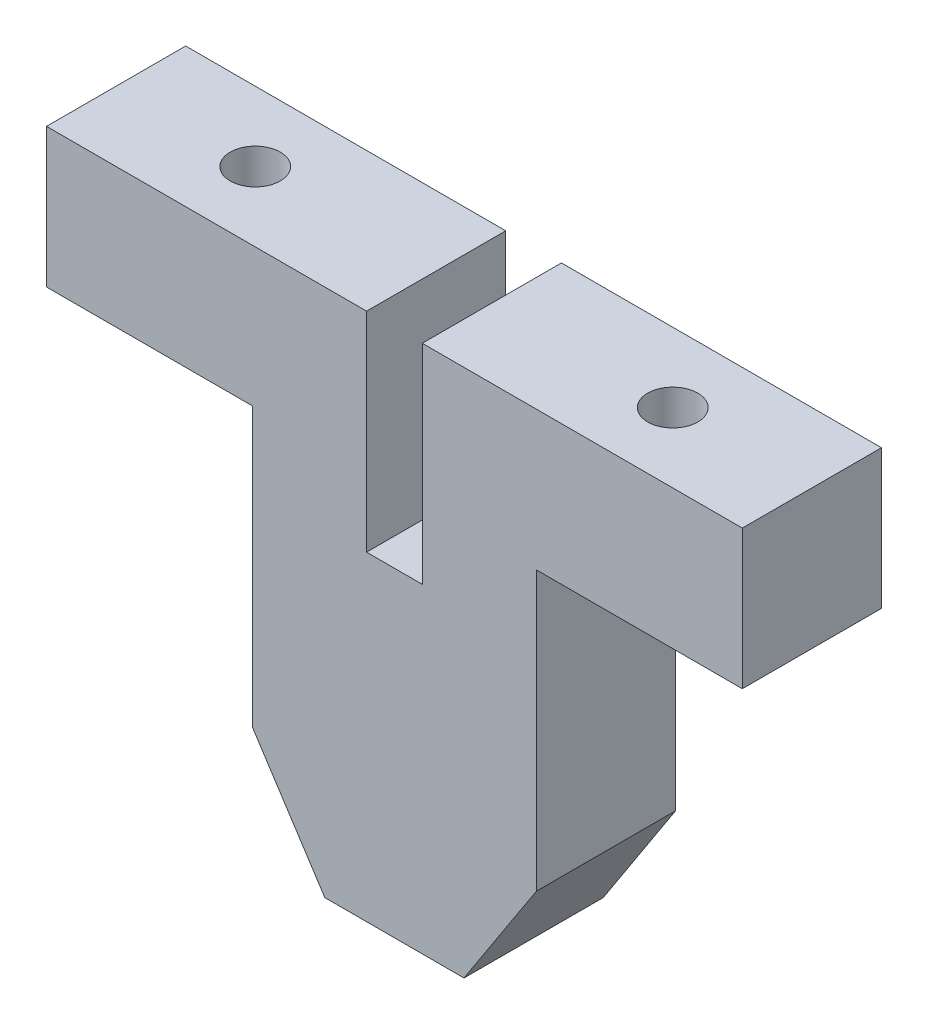
ISO-10303-21;
HEADER;
FILE_DESCRIPTION(('STEP AP214'),'2;1');
FILE_NAME('part.step','',(''),(''),'','','');
FILE_SCHEMA(('AUTOMOTIVE_DESIGN { 1 0 10303 214 1 1 1 1 }'));
ENDSEC;
DATA;
#1=APPLICATION_CONTEXT('core data for automotive mechanical design processes');
#2=APPLICATION_PROTOCOL_DEFINITION('international standard','automotive_design',2000,#1);
#3=PRODUCT_CONTEXT('',#1,'mechanical');
#4=PRODUCT('Part','Part','',(#3));
#5=PRODUCT_RELATED_PRODUCT_CATEGORY('part','',(#4));
#6=PRODUCT_DEFINITION_FORMATION('','',#4);
#7=PRODUCT_DEFINITION_CONTEXT('part definition',#1,'design');
#8=PRODUCT_DEFINITION('design','',#6,#7);
#9=PRODUCT_DEFINITION_SHAPE('','',#8);
#10=(LENGTH_UNIT() NAMED_UNIT(*) SI_UNIT(.MILLI.,.METRE.));
#11=(NAMED_UNIT(*) PLANE_ANGLE_UNIT() SI_UNIT($,.RADIAN.));
#12=(NAMED_UNIT(*) SI_UNIT($,.STERADIAN.) SOLID_ANGLE_UNIT());
#13=UNCERTAINTY_MEASURE_WITH_UNIT(LENGTH_MEASURE(1.E-05),#10,'distance_accuracy_value','');
#14=(GEOMETRIC_REPRESENTATION_CONTEXT(3) GLOBAL_UNCERTAINTY_ASSIGNED_CONTEXT((#13)) GLOBAL_UNIT_ASSIGNED_CONTEXT((#10,
#11,#12)) REPRESENTATION_CONTEXT('',''));
#15=CARTESIAN_POINT('',(0.,0.,0.));
#16=DIRECTION('',(0.,0.,1.));
#17=DIRECTION('',(1.,0.,0.));
#18=AXIS2_PLACEMENT_3D('',#15,#16,#17);
#19=CARTESIAN_POINT('',(0.,38.,10.));
#20=DIRECTION('',(0.,-1.,0.));
#21=DIRECTION('',(1.,0.,0.));
#22=AXIS2_PLACEMENT_3D('',#19,#20,#21);
#23=PLANE('',#22);
#24=CARTESIAN_POINT('',(10.,38.,5.));
#25=DIRECTION('',(0.,1.,0.));
#26=DIRECTION('',(-1.,0.,0.));
#27=AXIS2_PLACEMENT_3D('',#24,#25,#26);
#28=CIRCLE('',#27,1.8);
#29=CARTESIAN_POINT('',(8.2,38.,5.));
#30=VERTEX_POINT('',#29);
#31=EDGE_CURVE('E166',#30,#30,#28,.T.);
#32=ORIENTED_EDGE('',*,*,#31,.F.);
#33=EDGE_LOOP('',(#32));
#34=FACE_BOUND('',#33,.T.);
#35=DIRECTION('',(-1.,0.,0.));
#36=VECTOR('',#35,1.);
#37=CARTESIAN_POINT('',(0.,38.,10.));
#38=LINE('',#37,#36);
#39=CARTESIAN_POINT('',(23.,38.,10.));
#40=VERTEX_POINT('',#39);
#41=CARTESIAN_POINT('',(0.,38.,10.));
#42=VERTEX_POINT('',#41);
#43=EDGE_CURVE('E235',#40,#42,#38,.T.);
#44=ORIENTED_EDGE('',*,*,#43,.F.);
#45=DIRECTION('',(0.,0.,1.));
#46=VECTOR('',#45,1.);
#47=CARTESIAN_POINT('',(23.,38.,0.));
#48=LINE('',#47,#46);
#49=CARTESIAN_POINT('',(23.,38.,0.));
#50=VERTEX_POINT('',#49);
#51=EDGE_CURVE('E219',#50,#40,#48,.T.);
#52=ORIENTED_EDGE('',*,*,#51,.F.);
#53=DIRECTION('',(-1.,0.,0.));
#54=VECTOR('',#53,1.);
#55=CARTESIAN_POINT('',(0.,38.,0.));
#56=LINE('',#55,#54);
#57=CARTESIAN_POINT('',(0.,38.,0.));
#58=VERTEX_POINT('',#57);
#59=EDGE_CURVE('E161',#50,#58,#56,.T.);
#60=ORIENTED_EDGE('',*,*,#59,.T.);
#61=DIRECTION('',(0.,0.,-1.));
#62=VECTOR('',#61,1.);
#63=CARTESIAN_POINT('',(0.,38.,10.));
#64=LINE('',#63,#62);
#65=EDGE_CURVE('E42',#42,#58,#64,.T.);
#66=ORIENTED_EDGE('',*,*,#65,.F.);
#67=EDGE_LOOP('',(#44,#52,#60,#66));
#68=FACE_BOUND('',#67,.T.);
#69=ADVANCED_FACE('F33',(#34,#68),#23,.F.);
#70=CARTESIAN_POINT('',(50.,0.,10.));
#71=DIRECTION('',(0.,1.,0.));
#72=DIRECTION('',(-1.,0.,0.));
#73=AXIS2_PLACEMENT_3D('',#70,#71,#72);
#74=PLANE('',#73);
#75=DIRECTION('',(1.,0.,0.));
#76=VECTOR('',#75,1.);
#77=CARTESIAN_POINT('',(50.,0.,10.));
#78=LINE('',#77,#76);
#79=CARTESIAN_POINT('',(20.,0.,10.));
#80=VERTEX_POINT('',#79);
#81=CARTESIAN_POINT('',(30.,0.,10.));
#82=VERTEX_POINT('',#81);
#83=EDGE_CURVE('E173',#80,#82,#78,.T.);
#84=ORIENTED_EDGE('',*,*,#83,.F.);
#85=DIRECTION('',(0.,0.,1.));
#86=VECTOR('',#85,1.);
#87=CARTESIAN_POINT('',(20.,0.,0.));
#88=LINE('',#87,#86);
#89=CARTESIAN_POINT('',(20.,0.,0.));
#90=VERTEX_POINT('',#89);
#91=EDGE_CURVE('E195',#90,#80,#88,.T.);
#92=ORIENTED_EDGE('',*,*,#91,.F.);
#93=DIRECTION('',(1.,0.,0.));
#94=VECTOR('',#93,1.);
#95=CARTESIAN_POINT('',(50.,0.,0.));
#96=LINE('',#95,#94);
#97=CARTESIAN_POINT('',(30.,0.,0.));
#98=VERTEX_POINT('',#97);
#99=EDGE_CURVE('E162',#90,#98,#96,.T.);
#100=ORIENTED_EDGE('',*,*,#99,.T.);
#101=DIRECTION('',(0.,0.,1.));
#102=VECTOR('',#101,1.);
#103=CARTESIAN_POINT('',(30.,0.,0.));
#104=LINE('',#103,#102);
#105=EDGE_CURVE('E197',#98,#82,#104,.T.);
#106=ORIENTED_EDGE('',*,*,#105,.T.);
#107=EDGE_LOOP('',(#84,#92,#100,#106));
#108=FACE_BOUND('',#107,.T.);
#109=ADVANCED_FACE('F35',(#108),#74,.F.);
#110=CARTESIAN_POINT('',(50.,38.,10.));
#111=DIRECTION('',(-1.,0.,0.));
#112=DIRECTION('',(0.,-1.,0.));
#113=AXIS2_PLACEMENT_3D('',#110,#111,#112);
#114=PLANE('',#113);
#115=DIRECTION('',(0.,1.,0.));
#116=VECTOR('',#115,1.);
#117=CARTESIAN_POINT('',(50.,38.,10.));
#118=LINE('',#117,#116);
#119=CARTESIAN_POINT('',(50.,28.,10.));
#120=VERTEX_POINT('',#119);
#121=CARTESIAN_POINT('',(50.,38.,10.));
#122=VERTEX_POINT('',#121);
#123=EDGE_CURVE('E152',#120,#122,#118,.T.);
#124=ORIENTED_EDGE('',*,*,#123,.F.);
#125=DIRECTION('',(0.,0.,1.));
#126=VECTOR('',#125,1.);
#127=CARTESIAN_POINT('',(50.,28.,0.));
#128=LINE('',#127,#126);
#129=CARTESIAN_POINT('',(50.,28.,0.));
#130=VERTEX_POINT('',#129);
#131=EDGE_CURVE('E140',#130,#120,#128,.T.);
#132=ORIENTED_EDGE('',*,*,#131,.F.);
#133=DIRECTION('',(0.,1.,0.));
#134=VECTOR('',#133,1.);
#135=CARTESIAN_POINT('',(50.,38.,0.));
#136=LINE('',#135,#134);
#137=CARTESIAN_POINT('',(50.,38.,0.));
#138=VERTEX_POINT('',#137);
#139=EDGE_CURVE('E151',#130,#138,#136,.T.);
#140=ORIENTED_EDGE('',*,*,#139,.T.);
#141=DIRECTION('',(0.,0.,-1.));
#142=VECTOR('',#141,1.);
#143=CARTESIAN_POINT('',(50.,38.,10.));
#144=LINE('',#143,#142);
#145=EDGE_CURVE('E11',#122,#138,#144,.T.);
#146=ORIENTED_EDGE('',*,*,#145,.F.);
#147=EDGE_LOOP('',(#124,#132,#140,#146));
#148=FACE_BOUND('',#147,.T.);
#149=ADVANCED_FACE('F149',(#148),#114,.F.);
#150=CARTESIAN_POINT('',(40.,38.,5.));
#151=DIRECTION('',(0.,1.,0.));
#152=DIRECTION('',(-1.,0.,0.));
#153=AXIS2_PLACEMENT_3D('',#150,#151,#152);
#154=CIRCLE('',#153,1.8);
#155=CARTESIAN_POINT('',(38.2,38.,5.));
#156=VERTEX_POINT('',#155);
#157=EDGE_CURVE('E221',#156,#156,#154,.T.);
#158=ORIENTED_EDGE('',*,*,#157,.F.);
#159=EDGE_LOOP('',(#158));
#160=FACE_BOUND('',#159,.T.);
#161=CARTESIAN_POINT('',(27.,38.,0.));
#162=VERTEX_POINT('',#161);
#163=EDGE_CURVE('E160',#138,#162,#56,.T.);
#164=ORIENTED_EDGE('',*,*,#163,.T.);
#165=DIRECTION('',(0.,0.,1.));
#166=VECTOR('',#165,1.);
#167=CARTESIAN_POINT('',(27.,38.,0.));
#168=LINE('',#167,#166);
#169=CARTESIAN_POINT('',(27.,38.,10.));
#170=VERTEX_POINT('',#169);
#171=EDGE_CURVE('E222',#162,#170,#168,.T.);
#172=ORIENTED_EDGE('',*,*,#171,.T.);
#173=EDGE_CURVE('E236',#122,#170,#38,.T.);
#174=ORIENTED_EDGE('',*,*,#173,.F.);
#175=ORIENTED_EDGE('',*,*,#145,.T.);
#176=EDGE_LOOP('',(#164,#172,#174,#175));
#177=FACE_BOUND('',#176,.T.);
#178=ADVANCED_FACE('F285',(#160,#177),#23,.F.);
#179=CARTESIAN_POINT('',(0.,0.,10.));
#180=DIRECTION('',(1.,0.,0.));
#181=DIRECTION('',(0.,1.,0.));
#182=AXIS2_PLACEMENT_3D('',#179,#180,#181);
#183=PLANE('',#182);
#184=DIRECTION('',(0.,-1.,0.));
#185=VECTOR('',#184,1.);
#186=CARTESIAN_POINT('',(0.,0.,0.));
#187=LINE('',#186,#185);
#188=CARTESIAN_POINT('',(0.,28.,0.));
#189=VERTEX_POINT('',#188);
#190=EDGE_CURVE('E170',#58,#189,#187,.T.);
#191=ORIENTED_EDGE('',*,*,#190,.T.);
#192=DIRECTION('',(0.,0.,1.));
#193=VECTOR('',#192,1.);
#194=CARTESIAN_POINT('',(0.,28.,0.));
#195=LINE('',#194,#193);
#196=CARTESIAN_POINT('',(0.,28.,10.));
#197=VERTEX_POINT('',#196);
#198=EDGE_CURVE('E178',#189,#197,#195,.T.);
#199=ORIENTED_EDGE('',*,*,#198,.T.);
#200=DIRECTION('',(0.,-1.,0.));
#201=VECTOR('',#200,1.);
#202=CARTESIAN_POINT('',(0.,0.,10.));
#203=LINE('',#202,#201);
#204=EDGE_CURVE('E175',#42,#197,#203,.T.);
#205=ORIENTED_EDGE('',*,*,#204,.F.);
#206=ORIENTED_EDGE('',*,*,#65,.T.);
#207=EDGE_LOOP('',(#191,#199,#205,#206));
#208=FACE_BOUND('',#207,.T.);
#209=ADVANCED_FACE('F245',(#208),#183,.F.);
#210=CARTESIAN_POINT('',(0.,0.,10.));
#211=DIRECTION('',(0.,0.,-1.));
#212=DIRECTION('',(-1.,0.,0.));
#213=AXIS2_PLACEMENT_3D('',#210,#211,#212);
#214=PLANE('',#213);
#215=ORIENTED_EDGE('',*,*,#204,.T.);
#216=DIRECTION('',(-1.,0.,0.));
#217=VECTOR('',#216,1.);
#218=CARTESIAN_POINT('',(0.,28.,10.));
#219=LINE('',#218,#217);
#220=CARTESIAN_POINT('',(14.8,28.,10.));
#221=VERTEX_POINT('',#220);
#222=EDGE_CURVE('E145',#221,#197,#219,.T.);
#223=ORIENTED_EDGE('',*,*,#222,.F.);
#224=DIRECTION('',(0.,1.,0.));
#225=VECTOR('',#224,1.);
#226=CARTESIAN_POINT('',(14.8,28.,10.));
#227=LINE('',#226,#225);
#228=CARTESIAN_POINT('',(14.8,8.00000000000001,10.));
#229=VERTEX_POINT('',#228);
#230=EDGE_CURVE('E266',#229,#221,#227,.T.);
#231=ORIENTED_EDGE('',*,*,#230,.F.);
#232=DIRECTION('',(-0.544988350595414,0.838443616300637,0.));
#233=VECTOR('',#232,1.);
#234=CARTESIAN_POINT('',(14.8,8.00000000000001,10.));
#235=LINE('',#234,#233);
#236=EDGE_CURVE('E264',#80,#229,#235,.T.);
#237=ORIENTED_EDGE('',*,*,#236,.F.);
#238=ORIENTED_EDGE('',*,*,#83,.T.);
#239=DIRECTION('',(-0.544988350595414,-0.838443616300637,0.));
#240=VECTOR('',#239,1.);
#241=CARTESIAN_POINT('',(30.,0.,10.));
#242=LINE('',#241,#240);
#243=CARTESIAN_POINT('',(35.2,8.00000000000001,10.));
#244=VERTEX_POINT('',#243);
#245=EDGE_CURVE('E262',#244,#82,#242,.T.);
#246=ORIENTED_EDGE('',*,*,#245,.F.);
#247=DIRECTION('',(0.,-1.,0.));
#248=VECTOR('',#247,1.);
#249=CARTESIAN_POINT('',(35.2,8.00000000000001,10.));
#250=LINE('',#249,#248);
#251=CARTESIAN_POINT('',(35.2,28.,10.));
#252=VERTEX_POINT('',#251);
#253=EDGE_CURVE('E259',#252,#244,#250,.T.);
#254=ORIENTED_EDGE('',*,*,#253,.F.);
#255=DIRECTION('',(-1.,0.,0.));
#256=VECTOR('',#255,1.);
#257=CARTESIAN_POINT('',(35.2,28.,10.));
#258=LINE('',#257,#256);
#259=EDGE_CURVE('E257',#120,#252,#258,.T.);
#260=ORIENTED_EDGE('',*,*,#259,.F.);
#261=ORIENTED_EDGE('',*,*,#123,.T.);
#262=ORIENTED_EDGE('',*,*,#173,.T.);
#263=DIRECTION('',(0.,1.,0.));
#264=VECTOR('',#263,1.);
#265=CARTESIAN_POINT('',(27.,38.,10.));
#266=LINE('',#265,#264);
#267=CARTESIAN_POINT('',(27.,23.,10.));
#268=VERTEX_POINT('',#267);
#269=EDGE_CURVE('E207',#268,#170,#266,.T.);
#270=ORIENTED_EDGE('',*,*,#269,.F.);
#271=DIRECTION('',(1.,0.,0.));
#272=VECTOR('',#271,1.);
#273=CARTESIAN_POINT('',(23.,23.,10.));
#274=LINE('',#273,#272);
#275=CARTESIAN_POINT('',(23.,23.,10.));
#276=VERTEX_POINT('',#275);
#277=EDGE_CURVE('E215',#276,#268,#274,.T.);
#278=ORIENTED_EDGE('',*,*,#277,.F.);
#279=DIRECTION('',(0.,-1.,0.));
#280=VECTOR('',#279,1.);
#281=CARTESIAN_POINT('',(23.,38.,10.));
#282=LINE('',#281,#280);
#283=EDGE_CURVE('E182',#40,#276,#282,.T.);
#284=ORIENTED_EDGE('',*,*,#283,.F.);
#285=ORIENTED_EDGE('',*,*,#43,.T.);
#286=EDGE_LOOP('',(#215,#223,#231,#237,#238,#246,#254,#260,#261,#262,#270,#278,#284,#285));
#287=FACE_BOUND('',#286,.T.);
#288=ADVANCED_FACE('F240',(#287),#214,.F.);
#289=CARTESIAN_POINT('',(0.,0.,0.));
#290=DIRECTION('',(0.,0.,-1.));
#291=DIRECTION('',(-1.,0.,0.));
#292=AXIS2_PLACEMENT_3D('',#289,#290,#291);
#293=PLANE('',#292);
#294=DIRECTION('',(-1.,0.,0.));
#295=VECTOR('',#294,1.);
#296=CARTESIAN_POINT('',(0.,28.,0.));
#297=LINE('',#296,#295);
#298=CARTESIAN_POINT('',(14.8,28.,0.));
#299=VERTEX_POINT('',#298);
#300=EDGE_CURVE('E153',#299,#189,#297,.T.);
#301=ORIENTED_EDGE('',*,*,#300,.T.);
#302=ORIENTED_EDGE('',*,*,#190,.F.);
#303=ORIENTED_EDGE('',*,*,#59,.F.);
#304=DIRECTION('',(0.,-1.,0.));
#305=VECTOR('',#304,1.);
#306=CARTESIAN_POINT('',(23.,38.,0.));
#307=LINE('',#306,#305);
#308=CARTESIAN_POINT('',(23.,23.,0.));
#309=VERTEX_POINT('',#308);
#310=EDGE_CURVE('E203',#50,#309,#307,.T.);
#311=ORIENTED_EDGE('',*,*,#310,.T.);
#312=DIRECTION('',(1.,0.,0.));
#313=VECTOR('',#312,1.);
#314=CARTESIAN_POINT('',(23.,23.,0.));
#315=LINE('',#314,#313);
#316=CARTESIAN_POINT('',(27.,23.,0.));
#317=VERTEX_POINT('',#316);
#318=EDGE_CURVE('E206',#309,#317,#315,.T.);
#319=ORIENTED_EDGE('',*,*,#318,.T.);
#320=DIRECTION('',(0.,1.,0.));
#321=VECTOR('',#320,1.);
#322=CARTESIAN_POINT('',(27.,38.,0.));
#323=LINE('',#322,#321);
#324=EDGE_CURVE('E210',#317,#162,#323,.T.);
#325=ORIENTED_EDGE('',*,*,#324,.T.);
#326=ORIENTED_EDGE('',*,*,#163,.F.);
#327=ORIENTED_EDGE('',*,*,#139,.F.);
#328=DIRECTION('',(-1.,0.,0.));
#329=VECTOR('',#328,1.);
#330=CARTESIAN_POINT('',(35.2,28.,0.));
#331=LINE('',#330,#329);
#332=CARTESIAN_POINT('',(35.2,28.,0.));
#333=VERTEX_POINT('',#332);
#334=EDGE_CURVE('E135',#130,#333,#331,.T.);
#335=ORIENTED_EDGE('',*,*,#334,.T.);
#336=DIRECTION('',(0.,-1.,0.));
#337=VECTOR('',#336,1.);
#338=CARTESIAN_POINT('',(35.2,8.00000000000001,0.));
#339=LINE('',#338,#337);
#340=CARTESIAN_POINT('',(35.2,8.00000000000001,0.));
#341=VERTEX_POINT('',#340);
#342=EDGE_CURVE('E58',#333,#341,#339,.T.);
#343=ORIENTED_EDGE('',*,*,#342,.T.);
#344=DIRECTION('',(-0.544988350595414,-0.838443616300637,0.));
#345=VECTOR('',#344,1.);
#346=CARTESIAN_POINT('',(30.,0.,0.));
#347=LINE('',#346,#345);
#348=EDGE_CURVE('E309',#341,#98,#347,.T.);
#349=ORIENTED_EDGE('',*,*,#348,.T.);
#350=ORIENTED_EDGE('',*,*,#99,.F.);
#351=DIRECTION('',(-0.544988350595414,0.838443616300637,0.));
#352=VECTOR('',#351,1.);
#353=CARTESIAN_POINT('',(14.8,8.00000000000001,0.));
#354=LINE('',#353,#352);
#355=CARTESIAN_POINT('',(14.8,8.00000000000001,0.));
#356=VERTEX_POINT('',#355);
#357=EDGE_CURVE('E253',#90,#356,#354,.T.);
#358=ORIENTED_EDGE('',*,*,#357,.T.);
#359=DIRECTION('',(0.,1.,0.));
#360=VECTOR('',#359,1.);
#361=CARTESIAN_POINT('',(14.8,28.,0.));
#362=LINE('',#361,#360);
#363=EDGE_CURVE('E50',#356,#299,#362,.T.);
#364=ORIENTED_EDGE('',*,*,#363,.T.);
#365=EDGE_LOOP('',(#301,#302,#303,#311,#319,#325,#326,#327,#335,#343,#349,#350,#358,#364));
#366=FACE_BOUND('',#365,.T.);
#367=ADVANCED_FACE('F157',(#366),#293,.T.);
#368=CARTESIAN_POINT('',(10.,0.,5.));
#369=DIRECTION('',(0.,1.,0.));
#370=DIRECTION('',(-1.,0.,0.));
#371=AXIS2_PLACEMENT_3D('',#368,#369,#370);
#372=CYLINDRICAL_SURFACE('',#371,1.8);
#373=CARTESIAN_POINT('',(10.,28.,5.));
#374=DIRECTION('',(0.,1.,0.));
#375=DIRECTION('',(0.,0.,1.));
#376=AXIS2_PLACEMENT_3D('',#373,#374,#375);
#377=CIRCLE('',#376,1.8);
#378=CARTESIAN_POINT('',(10.,28.,6.8));
#379=VERTEX_POINT('',#378);
#380=EDGE_CURVE('E37',#379,#379,#377,.F.);
#381=ORIENTED_EDGE('',*,*,#380,.T.);
#382=EDGE_LOOP('',(#381));
#383=FACE_BOUND('',#382,.T.);
#384=ORIENTED_EDGE('',*,*,#31,.T.);
#385=EDGE_LOOP('',(#384));
#386=FACE_BOUND('',#385,.T.);
#387=ADVANCED_FACE('F340',(#383,#386),#372,.F.);
#388=CARTESIAN_POINT('',(40.,0.,5.));
#389=DIRECTION('',(0.,1.,0.));
#390=DIRECTION('',(-1.,0.,0.));
#391=AXIS2_PLACEMENT_3D('',#388,#389,#390);
#392=CYLINDRICAL_SURFACE('',#391,1.8);
#393=CARTESIAN_POINT('',(40.,28.,5.));
#394=DIRECTION('',(0.,1.,0.));
#395=DIRECTION('',(-1.,0.,0.));
#396=AXIS2_PLACEMENT_3D('',#393,#394,#395);
#397=CIRCLE('',#396,1.8);
#398=CARTESIAN_POINT('',(38.2,28.,5.));
#399=VERTEX_POINT('',#398);
#400=EDGE_CURVE('E176',#399,#399,#397,.F.);
#401=ORIENTED_EDGE('',*,*,#400,.T.);
#402=EDGE_LOOP('',(#401));
#403=FACE_BOUND('',#402,.T.);
#404=ORIENTED_EDGE('',*,*,#157,.T.);
#405=EDGE_LOOP('',(#404));
#406=FACE_BOUND('',#405,.T.);
#407=ADVANCED_FACE('F336',(#403,#406),#392,.F.);
#408=CARTESIAN_POINT('',(23.,38.,0.));
#409=DIRECTION('',(-1.,0.,0.));
#410=DIRECTION('',(0.,0.,1.));
#411=AXIS2_PLACEMENT_3D('',#408,#409,#410);
#412=PLANE('',#411);
#413=ORIENTED_EDGE('',*,*,#283,.T.);
#414=DIRECTION('',(0.,0.,1.));
#415=VECTOR('',#414,1.);
#416=CARTESIAN_POINT('',(23.,23.,0.));
#417=LINE('',#416,#415);
#418=EDGE_CURVE('E212',#309,#276,#417,.T.);
#419=ORIENTED_EDGE('',*,*,#418,.F.);
#420=ORIENTED_EDGE('',*,*,#310,.F.);
#421=ORIENTED_EDGE('',*,*,#51,.T.);
#422=EDGE_LOOP('',(#413,#419,#420,#421));
#423=FACE_BOUND('',#422,.T.);
#424=ADVANCED_FACE('F329',(#423),#412,.F.);
#425=CARTESIAN_POINT('',(27.,38.,0.));
#426=DIRECTION('',(1.,0.,0.));
#427=DIRECTION('',(0.,1.,0.));
#428=AXIS2_PLACEMENT_3D('',#425,#426,#427);
#429=PLANE('',#428);
#430=ORIENTED_EDGE('',*,*,#269,.T.);
#431=ORIENTED_EDGE('',*,*,#171,.F.);
#432=ORIENTED_EDGE('',*,*,#324,.F.);
#433=DIRECTION('',(0.,0.,1.));
#434=VECTOR('',#433,1.);
#435=CARTESIAN_POINT('',(27.,23.,0.));
#436=LINE('',#435,#434);
#437=EDGE_CURVE('E225',#317,#268,#436,.T.);
#438=ORIENTED_EDGE('',*,*,#437,.T.);
#439=EDGE_LOOP('',(#430,#431,#432,#438));
#440=FACE_BOUND('',#439,.T.);
#441=ADVANCED_FACE('F326',(#440),#429,.F.);
#442=CARTESIAN_POINT('',(23.,23.,0.));
#443=DIRECTION('',(0.,-1.,0.));
#444=DIRECTION('',(0.,0.,-1.));
#445=AXIS2_PLACEMENT_3D('',#442,#443,#444);
#446=PLANE('',#445);
#447=ORIENTED_EDGE('',*,*,#277,.T.);
#448=ORIENTED_EDGE('',*,*,#437,.F.);
#449=ORIENTED_EDGE('',*,*,#318,.F.);
#450=ORIENTED_EDGE('',*,*,#418,.T.);
#451=EDGE_LOOP('',(#447,#448,#449,#450));
#452=FACE_BOUND('',#451,.T.);
#453=ADVANCED_FACE('F325',(#452),#446,.F.);
#454=CARTESIAN_POINT('',(35.2,28.,0.));
#455=DIRECTION('',(0.,1.,0.));
#456=DIRECTION('',(-1.,0.,0.));
#457=AXIS2_PLACEMENT_3D('',#454,#455,#456);
#458=PLANE('',#457);
#459=ORIENTED_EDGE('',*,*,#259,.T.);
#460=DIRECTION('',(0.,0.,1.));
#461=VECTOR('',#460,1.);
#462=CARTESIAN_POINT('',(35.2,28.,0.));
#463=LINE('',#462,#461);
#464=EDGE_CURVE('E142',#333,#252,#463,.T.);
#465=ORIENTED_EDGE('',*,*,#464,.F.);
#466=ORIENTED_EDGE('',*,*,#334,.F.);
#467=ORIENTED_EDGE('',*,*,#131,.T.);
#468=EDGE_LOOP('',(#459,#465,#466,#467));
#469=FACE_BOUND('',#468,.T.);
#470=ORIENTED_EDGE('',*,*,#400,.F.);
#471=EDGE_LOOP('',(#470));
#472=FACE_BOUND('',#471,.T.);
#473=ADVANCED_FACE('F138',(#469,#472),#458,.F.);
#474=CARTESIAN_POINT('',(35.2,8.00000000000001,0.));
#475=DIRECTION('',(-1.,0.,0.));
#476=DIRECTION('',(0.,-1.,0.));
#477=AXIS2_PLACEMENT_3D('',#474,#475,#476);
#478=PLANE('',#477);
#479=ORIENTED_EDGE('',*,*,#253,.T.);
#480=DIRECTION('',(0.,0.,1.));
#481=VECTOR('',#480,1.);
#482=CARTESIAN_POINT('',(35.2,8.00000000000001,0.));
#483=LINE('',#482,#481);
#484=EDGE_CURVE('E200',#341,#244,#483,.T.);
#485=ORIENTED_EDGE('',*,*,#484,.F.);
#486=ORIENTED_EDGE('',*,*,#342,.F.);
#487=ORIENTED_EDGE('',*,*,#464,.T.);
#488=EDGE_LOOP('',(#479,#485,#486,#487));
#489=FACE_BOUND('',#488,.T.);
#490=ADVANCED_FACE('F305',(#489),#478,.F.);
#491=CARTESIAN_POINT('',(30.,0.,0.));
#492=DIRECTION('',(-0.838443616300637,0.544988350595414,0.));
#493=DIRECTION('',(-0.544988350595414,-0.838443616300637,0.));
#494=AXIS2_PLACEMENT_3D('',#491,#492,#493);
#495=PLANE('',#494);
#496=ORIENTED_EDGE('',*,*,#245,.T.);
#497=ORIENTED_EDGE('',*,*,#105,.F.);
#498=ORIENTED_EDGE('',*,*,#348,.F.);
#499=ORIENTED_EDGE('',*,*,#484,.T.);
#500=EDGE_LOOP('',(#496,#497,#498,#499));
#501=FACE_BOUND('',#500,.T.);
#502=ADVANCED_FACE('F280',(#501),#495,.F.);
#503=CARTESIAN_POINT('',(0.,28.,0.));
#504=DIRECTION('',(0.,1.,0.));
#505=DIRECTION('',(0.,0.,1.));
#506=AXIS2_PLACEMENT_3D('',#503,#504,#505);
#507=PLANE('',#506);
#508=ORIENTED_EDGE('',*,*,#222,.T.);
#509=ORIENTED_EDGE('',*,*,#198,.F.);
#510=ORIENTED_EDGE('',*,*,#300,.F.);
#511=DIRECTION('',(0.,0.,1.));
#512=VECTOR('',#511,1.);
#513=CARTESIAN_POINT('',(14.8,28.,0.));
#514=LINE('',#513,#512);
#515=EDGE_CURVE('E184',#299,#221,#514,.T.);
#516=ORIENTED_EDGE('',*,*,#515,.T.);
#517=EDGE_LOOP('',(#508,#509,#510,#516));
#518=FACE_BOUND('',#517,.T.);
#519=ORIENTED_EDGE('',*,*,#380,.F.);
#520=EDGE_LOOP('',(#519));
#521=FACE_BOUND('',#520,.T.);
#522=ADVANCED_FACE('F268',(#518,#521),#507,.F.);
#523=CARTESIAN_POINT('',(14.8,28.,0.));
#524=DIRECTION('',(1.,0.,0.));
#525=DIRECTION('',(0.,1.,0.));
#526=AXIS2_PLACEMENT_3D('',#523,#524,#525);
#527=PLANE('',#526);
#528=ORIENTED_EDGE('',*,*,#230,.T.);
#529=ORIENTED_EDGE('',*,*,#515,.F.);
#530=ORIENTED_EDGE('',*,*,#363,.F.);
#531=DIRECTION('',(0.,0.,1.));
#532=VECTOR('',#531,1.);
#533=CARTESIAN_POINT('',(14.8,8.00000000000001,0.));
#534=LINE('',#533,#532);
#535=EDGE_CURVE('E189',#356,#229,#534,.T.);
#536=ORIENTED_EDGE('',*,*,#535,.T.);
#537=EDGE_LOOP('',(#528,#529,#530,#536));
#538=FACE_BOUND('',#537,.T.);
#539=ADVANCED_FACE('F270',(#538),#527,.F.);
#540=CARTESIAN_POINT('',(14.8,8.00000000000001,0.));
#541=DIRECTION('',(0.838443616300637,0.544988350595414,0.));
#542=DIRECTION('',(-0.544988350595414,0.838443616300637,0.));
#543=AXIS2_PLACEMENT_3D('',#540,#541,#542);
#544=PLANE('',#543);
#545=ORIENTED_EDGE('',*,*,#236,.T.);
#546=ORIENTED_EDGE('',*,*,#535,.F.);
#547=ORIENTED_EDGE('',*,*,#357,.F.);
#548=ORIENTED_EDGE('',*,*,#91,.T.);
#549=EDGE_LOOP('',(#545,#546,#547,#548));
#550=FACE_BOUND('',#549,.T.);
#551=ADVANCED_FACE('F272',(#550),#544,.F.);
#552=CLOSED_SHELL('',(#69,#109,#149,#178,#209,#288,#367,#387,#407,#424,#441,#453,#473,#490,#502,
#522,#539,#551));
#553=MANIFOLD_SOLID_BREP('B2',#552);
#554=ADVANCED_BREP_SHAPE_REPRESENTATION('',(#18,#553),#14);
#555=SHAPE_DEFINITION_REPRESENTATION(#9,#554);
ENDSEC;
END-ISO-10303-21;
